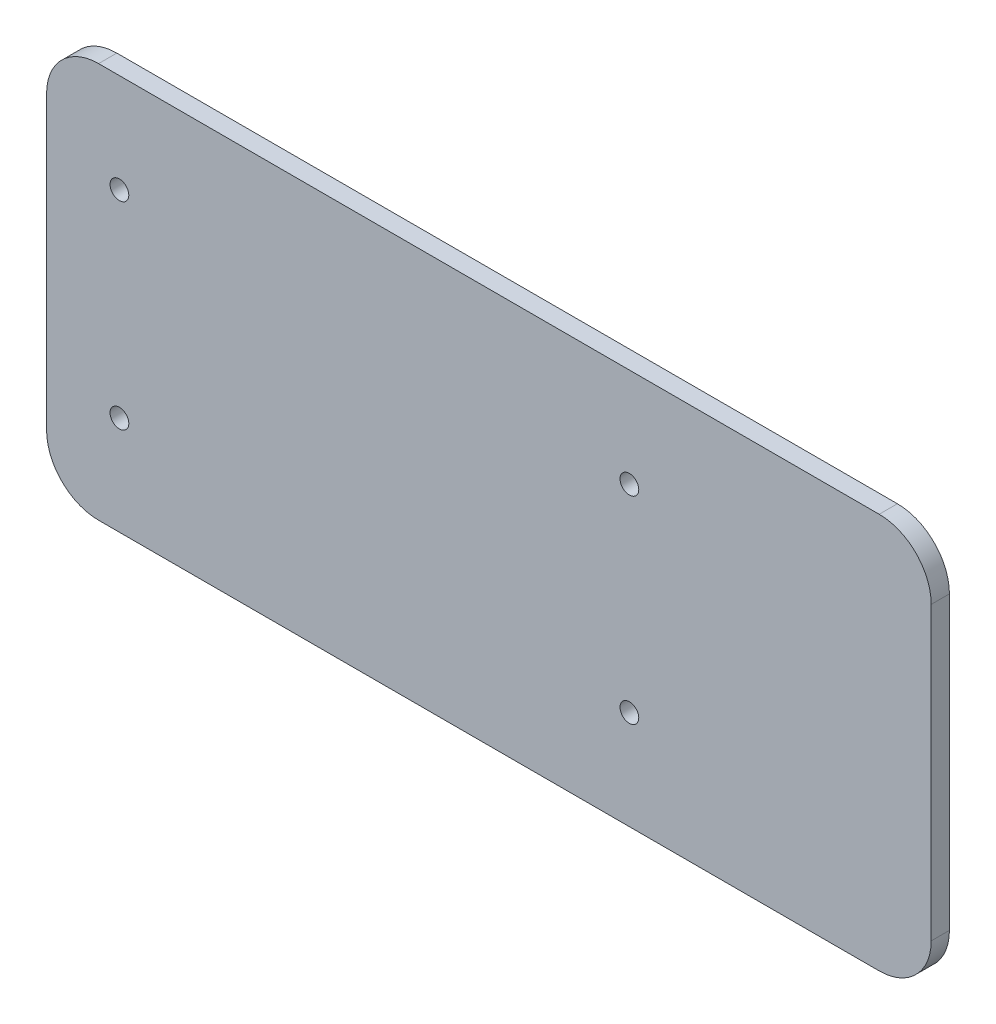
ISO-10303-21;
HEADER;
FILE_DESCRIPTION(('STEP AP214'),'2;1');
FILE_NAME('part.step','',(''),(''),'','','');
FILE_SCHEMA(('AUTOMOTIVE_DESIGN { 1 0 10303 214 1 1 1 1 }'));
ENDSEC;
DATA;
#1=APPLICATION_CONTEXT('core data for automotive mechanical design processes');
#2=APPLICATION_PROTOCOL_DEFINITION('international standard','automotive_design',2000,#1);
#3=PRODUCT_CONTEXT('',#1,'mechanical');
#4=PRODUCT('Part','Part','',(#3));
#5=PRODUCT_RELATED_PRODUCT_CATEGORY('part','',(#4));
#6=PRODUCT_DEFINITION_FORMATION('','',#4);
#7=PRODUCT_DEFINITION_CONTEXT('part definition',#1,'design');
#8=PRODUCT_DEFINITION('design','',#6,#7);
#9=PRODUCT_DEFINITION_SHAPE('','',#8);
#10=(LENGTH_UNIT() NAMED_UNIT(*) SI_UNIT(.MILLI.,.METRE.));
#11=(NAMED_UNIT(*) PLANE_ANGLE_UNIT() SI_UNIT($,.RADIAN.));
#12=(NAMED_UNIT(*) SI_UNIT($,.STERADIAN.) SOLID_ANGLE_UNIT());
#13=UNCERTAINTY_MEASURE_WITH_UNIT(LENGTH_MEASURE(1.E-05),#10,'distance_accuracy_value','');
#14=(GEOMETRIC_REPRESENTATION_CONTEXT(3) GLOBAL_UNCERTAINTY_ASSIGNED_CONTEXT((#13)) GLOBAL_UNIT_ASSIGNED_CONTEXT((#10,
#11,#12)) REPRESENTATION_CONTEXT('',''));
#15=CARTESIAN_POINT('',(0.,0.,0.));
#16=DIRECTION('',(0.,0.,1.));
#17=DIRECTION('',(1.,0.,0.));
#18=AXIS2_PLACEMENT_3D('',#15,#16,#17);
#19=CARTESIAN_POINT('',(85.,38.,3.5));
#20=DIRECTION('',(-1.,0.,0.));
#21=DIRECTION('',(0.,-1.,0.));
#22=AXIS2_PLACEMENT_3D('',#19,#20,#21);
#23=PLANE('',#22);
#24=DIRECTION('',(0.,1.,0.));
#25=VECTOR('',#24,1.);
#26=CARTESIAN_POINT('',(85.,38.,3.5));
#27=LINE('',#26,#25);
#28=CARTESIAN_POINT('',(85.,-28.,3.5));
#29=VERTEX_POINT('',#28);
#30=CARTESIAN_POINT('',(85.,28.,3.5));
#31=VERTEX_POINT('',#30);
#32=EDGE_CURVE('E229',#29,#31,#27,.T.);
#33=ORIENTED_EDGE('',*,*,#32,.F.);
#34=DIRECTION('',(0.,0.,-1.));
#35=VECTOR('',#34,1.);
#36=CARTESIAN_POINT('',(85.,-28.,3.5));
#37=LINE('',#36,#35);
#38=CARTESIAN_POINT('',(85.,-28.,0.));
#39=VERTEX_POINT('',#38);
#40=EDGE_CURVE('E11',#29,#39,#37,.T.);
#41=ORIENTED_EDGE('',*,*,#40,.T.);
#42=DIRECTION('',(0.,1.,0.));
#43=VECTOR('',#42,1.);
#44=CARTESIAN_POINT('',(85.,38.,0.));
#45=LINE('',#44,#43);
#46=CARTESIAN_POINT('',(85.,28.,0.));
#47=VERTEX_POINT('',#46);
#48=EDGE_CURVE('E223',#39,#47,#45,.T.);
#49=ORIENTED_EDGE('',*,*,#48,.T.);
#50=DIRECTION('',(0.,0.,-1.));
#51=VECTOR('',#50,1.);
#52=CARTESIAN_POINT('',(85.,28.,3.5));
#53=LINE('',#52,#51);
#54=EDGE_CURVE('E52',#47,#31,#53,.F.);
#55=ORIENTED_EDGE('',*,*,#54,.T.);
#56=EDGE_LOOP('',(#33,#41,#49,#55));
#57=FACE_BOUND('',#56,.T.);
#58=ADVANCED_FACE('F44',(#57),#23,.F.);
#59=CARTESIAN_POINT('',(-85.,38.,3.5));
#60=DIRECTION('',(0.,-1.,0.));
#61=DIRECTION('',(0.,0.,-1.));
#62=AXIS2_PLACEMENT_3D('',#59,#60,#61);
#63=PLANE('',#62);
#64=DIRECTION('',(-1.,0.,0.));
#65=VECTOR('',#64,1.);
#66=CARTESIAN_POINT('',(-85.,38.,0.));
#67=LINE('',#66,#65);
#68=CARTESIAN_POINT('',(75.,38.,0.));
#69=VERTEX_POINT('',#68);
#70=CARTESIAN_POINT('',(-75.,38.,0.));
#71=VERTEX_POINT('',#70);
#72=EDGE_CURVE('E245',#69,#71,#67,.T.);
#73=ORIENTED_EDGE('',*,*,#72,.T.);
#74=DIRECTION('',(0.,0.,-1.));
#75=VECTOR('',#74,1.);
#76=CARTESIAN_POINT('',(-75.,38.,3.5));
#77=LINE('',#76,#75);
#78=CARTESIAN_POINT('',(-75.,38.,3.5));
#79=VERTEX_POINT('',#78);
#80=EDGE_CURVE('E268',#71,#79,#77,.F.);
#81=ORIENTED_EDGE('',*,*,#80,.T.);
#82=DIRECTION('',(-1.,0.,0.));
#83=VECTOR('',#82,1.);
#84=CARTESIAN_POINT('',(-85.,38.,3.5));
#85=LINE('',#84,#83);
#86=CARTESIAN_POINT('',(75.,38.,3.5));
#87=VERTEX_POINT('',#86);
#88=EDGE_CURVE('E232',#87,#79,#85,.T.);
#89=ORIENTED_EDGE('',*,*,#88,.F.);
#90=DIRECTION('',(0.,0.,-1.));
#91=VECTOR('',#90,1.);
#92=CARTESIAN_POINT('',(75.,38.,3.5));
#93=LINE('',#92,#91);
#94=EDGE_CURVE('E265',#87,#69,#93,.T.);
#95=ORIENTED_EDGE('',*,*,#94,.T.);
#96=EDGE_LOOP('',(#73,#81,#89,#95));
#97=FACE_BOUND('',#96,.T.);
#98=ADVANCED_FACE('F296',(#97),#63,.F.);
#99=CARTESIAN_POINT('',(-85.,38.,3.5));
#100=DIRECTION('',(1.,0.,0.));
#101=DIRECTION('',(0.,1.,0.));
#102=AXIS2_PLACEMENT_3D('',#99,#100,#101);
#103=PLANE('',#102);
#104=DIRECTION('',(0.,-1.,0.));
#105=VECTOR('',#104,1.);
#106=CARTESIAN_POINT('',(-85.,38.,3.5));
#107=LINE('',#106,#105);
#108=CARTESIAN_POINT('',(-85.,28.,3.5));
#109=VERTEX_POINT('',#108);
#110=CARTESIAN_POINT('',(-85.,-28.,3.5));
#111=VERTEX_POINT('',#110);
#112=EDGE_CURVE('E236',#109,#111,#107,.T.);
#113=ORIENTED_EDGE('',*,*,#112,.F.);
#114=DIRECTION('',(0.,0.,-1.));
#115=VECTOR('',#114,1.);
#116=CARTESIAN_POINT('',(-85.,28.,3.5));
#117=LINE('',#116,#115);
#118=CARTESIAN_POINT('',(-85.,28.,0.));
#119=VERTEX_POINT('',#118);
#120=EDGE_CURVE('E254',#109,#119,#117,.T.);
#121=ORIENTED_EDGE('',*,*,#120,.T.);
#122=DIRECTION('',(0.,-1.,0.));
#123=VECTOR('',#122,1.);
#124=CARTESIAN_POINT('',(-85.,38.,0.));
#125=LINE('',#124,#123);
#126=CARTESIAN_POINT('',(-85.,-28.,0.));
#127=VERTEX_POINT('',#126);
#128=EDGE_CURVE('E248',#119,#127,#125,.T.);
#129=ORIENTED_EDGE('',*,*,#128,.T.);
#130=DIRECTION('',(0.,0.,-1.));
#131=VECTOR('',#130,1.);
#132=CARTESIAN_POINT('',(-85.,-28.,3.5));
#133=LINE('',#132,#131);
#134=EDGE_CURVE('E242',#127,#111,#133,.F.);
#135=ORIENTED_EDGE('',*,*,#134,.T.);
#136=EDGE_LOOP('',(#113,#121,#129,#135));
#137=FACE_BOUND('',#136,.T.);
#138=ADVANCED_FACE('F307',(#137),#103,.F.);
#139=CARTESIAN_POINT('',(-85.,-38.,3.5));
#140=DIRECTION('',(0.,1.,0.));
#141=DIRECTION('',(0.,0.,1.));
#142=AXIS2_PLACEMENT_3D('',#139,#140,#141);
#143=PLANE('',#142);
#144=DIRECTION('',(1.,0.,0.));
#145=VECTOR('',#144,1.);
#146=CARTESIAN_POINT('',(-85.,-38.,3.5));
#147=LINE('',#146,#145);
#148=CARTESIAN_POINT('',(-75.,-38.,3.5));
#149=VERTEX_POINT('',#148);
#150=CARTESIAN_POINT('',(75.,-38.,3.5));
#151=VERTEX_POINT('',#150);
#152=EDGE_CURVE('E239',#149,#151,#147,.T.);
#153=ORIENTED_EDGE('',*,*,#152,.F.);
#154=DIRECTION('',(0.,0.,-1.));
#155=VECTOR('',#154,1.);
#156=CARTESIAN_POINT('',(-75.,-38.,3.5));
#157=LINE('',#156,#155);
#158=CARTESIAN_POINT('',(-75.,-38.,0.));
#159=VERTEX_POINT('',#158);
#160=EDGE_CURVE('E280',#149,#159,#157,.T.);
#161=ORIENTED_EDGE('',*,*,#160,.T.);
#162=DIRECTION('',(1.,0.,0.));
#163=VECTOR('',#162,1.);
#164=CARTESIAN_POINT('',(-85.,-38.,0.));
#165=LINE('',#164,#163);
#166=CARTESIAN_POINT('',(75.,-38.,0.));
#167=VERTEX_POINT('',#166);
#168=EDGE_CURVE('E233',#159,#167,#165,.T.);
#169=ORIENTED_EDGE('',*,*,#168,.T.);
#170=DIRECTION('',(0.,0.,-1.));
#171=VECTOR('',#170,1.);
#172=CARTESIAN_POINT('',(75.,-38.,3.5));
#173=LINE('',#172,#171);
#174=EDGE_CURVE('E278',#167,#151,#173,.F.);
#175=ORIENTED_EDGE('',*,*,#174,.T.);
#176=EDGE_LOOP('',(#153,#161,#169,#175));
#177=FACE_BOUND('',#176,.T.);
#178=ADVANCED_FACE('F316',(#177),#143,.F.);
#179=CARTESIAN_POINT('',(0.,0.,3.5));
#180=DIRECTION('',(0.,0.,1.));
#181=DIRECTION('',(1.,0.,0.));
#182=AXIS2_PLACEMENT_3D('',#179,#180,#181);
#183=PLANE('',#182);
#184=CARTESIAN_POINT('',(27.,19.,3.5));
#185=DIRECTION('',(0.,0.,1.));
#186=DIRECTION('',(1.,0.,0.));
#187=AXIS2_PLACEMENT_3D('',#184,#185,#186);
#188=CIRCLE('',#187,1.79999999999999);
#189=CARTESIAN_POINT('',(28.8,19.,3.5));
#190=VERTEX_POINT('',#189);
#191=EDGE_CURVE('E614',#190,#190,#188,.T.);
#192=ORIENTED_EDGE('',*,*,#191,.F.);
#193=EDGE_LOOP('',(#192));
#194=FACE_BOUND('',#193,.T.);
#195=CARTESIAN_POINT('',(27.,-19.,3.5));
#196=DIRECTION('',(0.,0.,1.));
#197=DIRECTION('',(1.,0.,0.));
#198=AXIS2_PLACEMENT_3D('',#195,#196,#197);
#199=CIRCLE('',#198,1.79999999999999);
#200=CARTESIAN_POINT('',(28.8,-19.,3.5));
#201=VERTEX_POINT('',#200);
#202=EDGE_CURVE('E608',#201,#201,#199,.F.);
#203=ORIENTED_EDGE('',*,*,#202,.T.);
#204=EDGE_LOOP('',(#203));
#205=FACE_BOUND('',#204,.T.);
#206=CARTESIAN_POINT('',(-71.,19.,3.5));
#207=DIRECTION('',(0.,0.,1.));
#208=DIRECTION('',(1.,0.,0.));
#209=AXIS2_PLACEMENT_3D('',#206,#207,#208);
#210=CIRCLE('',#209,1.79999999999999);
#211=CARTESIAN_POINT('',(-69.2,19.,3.5));
#212=VERTEX_POINT('',#211);
#213=EDGE_CURVE('E601',#212,#212,#210,.F.);
#214=ORIENTED_EDGE('',*,*,#213,.T.);
#215=EDGE_LOOP('',(#214));
#216=FACE_BOUND('',#215,.T.);
#217=CARTESIAN_POINT('',(-71.,-19.,3.5));
#218=DIRECTION('',(0.,0.,1.));
#219=DIRECTION('',(1.,0.,0.));
#220=AXIS2_PLACEMENT_3D('',#217,#218,#219);
#221=CIRCLE('',#220,1.79999999999999);
#222=CARTESIAN_POINT('',(-69.2,-19.,3.5));
#223=VERTEX_POINT('',#222);
#224=EDGE_CURVE('E183',#223,#223,#221,.T.);
#225=ORIENTED_EDGE('',*,*,#224,.F.);
#226=EDGE_LOOP('',(#225));
#227=FACE_BOUND('',#226,.T.);
#228=ORIENTED_EDGE('',*,*,#88,.T.);
#229=CARTESIAN_POINT('',(-75.,28.,3.5));
#230=DIRECTION('',(0.,0.,1.));
#231=DIRECTION('',(1.,0.,0.));
#232=AXIS2_PLACEMENT_3D('',#229,#230,#231);
#233=CIRCLE('',#232,10.);
#234=EDGE_CURVE('E276',#79,#109,#233,.T.);
#235=ORIENTED_EDGE('',*,*,#234,.T.);
#236=ORIENTED_EDGE('',*,*,#112,.T.);
#237=CARTESIAN_POINT('',(-75.,-28.,3.5));
#238=DIRECTION('',(0.,0.,1.));
#239=DIRECTION('',(1.,0.,0.));
#240=AXIS2_PLACEMENT_3D('',#237,#238,#239);
#241=CIRCLE('',#240,10.);
#242=EDGE_CURVE('E274',#111,#149,#241,.T.);
#243=ORIENTED_EDGE('',*,*,#242,.T.);
#244=ORIENTED_EDGE('',*,*,#152,.T.);
#245=CARTESIAN_POINT('',(75.,-28.,3.5));
#246=DIRECTION('',(0.,0.,1.));
#247=DIRECTION('',(1.,0.,0.));
#248=AXIS2_PLACEMENT_3D('',#245,#246,#247);
#249=CIRCLE('',#248,10.);
#250=EDGE_CURVE('E272',#151,#29,#249,.T.);
#251=ORIENTED_EDGE('',*,*,#250,.T.);
#252=ORIENTED_EDGE('',*,*,#32,.T.);
#253=CARTESIAN_POINT('',(75.,28.,3.5));
#254=DIRECTION('',(0.,0.,1.));
#255=DIRECTION('',(1.,0.,0.));
#256=AXIS2_PLACEMENT_3D('',#253,#254,#255);
#257=CIRCLE('',#256,10.);
#258=EDGE_CURVE('E270',#31,#87,#257,.T.);
#259=ORIENTED_EDGE('',*,*,#258,.T.);
#260=EDGE_LOOP('',(#228,#235,#236,#243,#244,#251,#252,#259));
#261=FACE_BOUND('',#260,.T.);
#262=ADVANCED_FACE('F290',(#194,#205,#216,#227,#261),#183,.T.);
#263=CARTESIAN_POINT('',(0.,0.,0.));
#264=DIRECTION('',(0.,0.,1.));
#265=DIRECTION('',(1.,0.,0.));
#266=AXIS2_PLACEMENT_3D('',#263,#264,#265);
#267=PLANE('',#266);
#268=CARTESIAN_POINT('',(27.,19.,0.));
#269=DIRECTION('',(0.,0.,-1.));
#270=DIRECTION('',(1.,0.,0.));
#271=AXIS2_PLACEMENT_3D('',#268,#269,#270);
#272=CIRCLE('',#271,1.79999999999999);
#273=CARTESIAN_POINT('',(28.8,19.,0.));
#274=VERTEX_POINT('',#273);
#275=EDGE_CURVE('E617',#274,#274,#272,.T.);
#276=ORIENTED_EDGE('',*,*,#275,.F.);
#277=EDGE_LOOP('',(#276));
#278=FACE_BOUND('',#277,.T.);
#279=CARTESIAN_POINT('',(27.,-19.,0.));
#280=DIRECTION('',(0.,0.,1.));
#281=DIRECTION('',(1.,0.,0.));
#282=AXIS2_PLACEMENT_3D('',#279,#280,#281);
#283=CIRCLE('',#282,1.79999999999999);
#284=CARTESIAN_POINT('',(28.8,-19.,0.));
#285=VERTEX_POINT('',#284);
#286=EDGE_CURVE('E611',#285,#285,#283,.T.);
#287=ORIENTED_EDGE('',*,*,#286,.T.);
#288=EDGE_LOOP('',(#287));
#289=FACE_BOUND('',#288,.T.);
#290=CARTESIAN_POINT('',(-71.,19.,0.));
#291=DIRECTION('',(0.,0.,1.));
#292=DIRECTION('',(-1.,0.,0.));
#293=AXIS2_PLACEMENT_3D('',#290,#291,#292);
#294=CIRCLE('',#293,1.79999999999999);
#295=CARTESIAN_POINT('',(-72.8,19.,0.));
#296=VERTEX_POINT('',#295);
#297=EDGE_CURVE('E603',#296,#296,#294,.T.);
#298=ORIENTED_EDGE('',*,*,#297,.T.);
#299=EDGE_LOOP('',(#298));
#300=FACE_BOUND('',#299,.T.);
#301=CARTESIAN_POINT('',(-71.,-19.,0.));
#302=DIRECTION('',(0.,0.,-1.));
#303=DIRECTION('',(-1.,0.,0.));
#304=AXIS2_PLACEMENT_3D('',#301,#302,#303);
#305=CIRCLE('',#304,1.79999999999999);
#306=CARTESIAN_POINT('',(-72.8,-19.,0.));
#307=VERTEX_POINT('',#306);
#308=EDGE_CURVE('E599',#307,#307,#305,.T.);
#309=ORIENTED_EDGE('',*,*,#308,.F.);
#310=EDGE_LOOP('',(#309));
#311=FACE_BOUND('',#310,.T.);
#312=DIRECTION('',(-1.,0.,0.));
#313=VECTOR('',#312,1.);
#314=CARTESIAN_POINT('',(-75.,-9.99999999999999,0.));
#315=LINE('',#314,#313);
#316=CARTESIAN_POINT('',(-67.,-9.99999999999999,0.));
#317=VERTEX_POINT('',#316);
#318=CARTESIAN_POINT('',(-75.,-9.99999999999999,0.));
#319=VERTEX_POINT('',#318);
#320=EDGE_CURVE('E189',#317,#319,#315,.T.);
#321=ORIENTED_EDGE('',*,*,#320,.F.);
#322=DIRECTION('',(0.,-1.,0.));
#323=VECTOR('',#322,1.);
#324=CARTESIAN_POINT('',(-67.,10.,0.));
#325=LINE('',#324,#323);
#326=CARTESIAN_POINT('',(-67.,10.,0.));
#327=VERTEX_POINT('',#326);
#328=EDGE_CURVE('E59',#327,#317,#325,.T.);
#329=ORIENTED_EDGE('',*,*,#328,.F.);
#330=DIRECTION('',(1.,0.,0.));
#331=VECTOR('',#330,1.);
#332=CARTESIAN_POINT('',(-75.,10.,0.));
#333=LINE('',#332,#331);
#334=CARTESIAN_POINT('',(-75.,10.,0.));
#335=VERTEX_POINT('',#334);
#336=EDGE_CURVE('E177',#335,#327,#333,.T.);
#337=ORIENTED_EDGE('',*,*,#336,.F.);
#338=DIRECTION('',(0.,1.,0.));
#339=VECTOR('',#338,1.);
#340=CARTESIAN_POINT('',(-75.,10.,0.));
#341=LINE('',#340,#339);
#342=EDGE_CURVE('E180',#319,#335,#341,.T.);
#343=ORIENTED_EDGE('',*,*,#342,.F.);
#344=EDGE_LOOP('',(#321,#329,#337,#343));
#345=FACE_BOUND('',#344,.T.);
#346=DIRECTION('',(-1.,0.,0.));
#347=VECTOR('',#346,1.);
#348=CARTESIAN_POINT('',(23.,-9.99999999999999,0.));
#349=LINE('',#348,#347);
#350=CARTESIAN_POINT('',(31.,-9.99999999999999,0.));
#351=VERTEX_POINT('',#350);
#352=CARTESIAN_POINT('',(23.,-9.99999999999999,0.));
#353=VERTEX_POINT('',#352);
#354=EDGE_CURVE('E213',#351,#353,#349,.T.);
#355=ORIENTED_EDGE('',*,*,#354,.F.);
#356=DIRECTION('',(0.,-1.,0.));
#357=VECTOR('',#356,1.);
#358=CARTESIAN_POINT('',(31.,10.,0.));
#359=LINE('',#358,#357);
#360=CARTESIAN_POINT('',(31.,10.,0.));
#361=VERTEX_POINT('',#360);
#362=EDGE_CURVE('E67',#361,#351,#359,.T.);
#363=ORIENTED_EDGE('',*,*,#362,.F.);
#364=DIRECTION('',(1.,0.,0.));
#365=VECTOR('',#364,1.);
#366=CARTESIAN_POINT('',(23.,10.,0.));
#367=LINE('',#366,#365);
#368=CARTESIAN_POINT('',(23.,10.,0.));
#369=VERTEX_POINT('',#368);
#370=EDGE_CURVE('E202',#369,#361,#367,.T.);
#371=ORIENTED_EDGE('',*,*,#370,.F.);
#372=DIRECTION('',(0.,1.,0.));
#373=VECTOR('',#372,1.);
#374=CARTESIAN_POINT('',(23.,10.,0.));
#375=LINE('',#374,#373);
#376=EDGE_CURVE('E216',#353,#369,#375,.T.);
#377=ORIENTED_EDGE('',*,*,#376,.F.);
#378=EDGE_LOOP('',(#355,#363,#371,#377));
#379=FACE_BOUND('',#378,.T.);
#380=ORIENTED_EDGE('',*,*,#128,.F.);
#381=CARTESIAN_POINT('',(-75.,28.,0.));
#382=DIRECTION('',(0.,0.,1.));
#383=DIRECTION('',(1.,0.,0.));
#384=AXIS2_PLACEMENT_3D('',#381,#382,#383);
#385=CIRCLE('',#384,10.);
#386=EDGE_CURVE('E263',#119,#71,#385,.F.);
#387=ORIENTED_EDGE('',*,*,#386,.T.);
#388=ORIENTED_EDGE('',*,*,#72,.F.);
#389=CARTESIAN_POINT('',(75.,28.,0.));
#390=DIRECTION('',(0.,0.,1.));
#391=DIRECTION('',(1.,0.,0.));
#392=AXIS2_PLACEMENT_3D('',#389,#390,#391);
#393=CIRCLE('',#392,10.);
#394=EDGE_CURVE('E257',#69,#47,#393,.F.);
#395=ORIENTED_EDGE('',*,*,#394,.T.);
#396=ORIENTED_EDGE('',*,*,#48,.F.);
#397=CARTESIAN_POINT('',(75.,-28.,0.));
#398=DIRECTION('',(0.,0.,1.));
#399=DIRECTION('',(1.,0.,0.));
#400=AXIS2_PLACEMENT_3D('',#397,#398,#399);
#401=CIRCLE('',#400,10.);
#402=EDGE_CURVE('E259',#39,#167,#401,.F.);
#403=ORIENTED_EDGE('',*,*,#402,.T.);
#404=ORIENTED_EDGE('',*,*,#168,.F.);
#405=CARTESIAN_POINT('',(-75.,-28.,0.));
#406=DIRECTION('',(0.,0.,1.));
#407=DIRECTION('',(1.,0.,0.));
#408=AXIS2_PLACEMENT_3D('',#405,#406,#407);
#409=CIRCLE('',#408,10.);
#410=EDGE_CURVE('E261',#159,#127,#409,.F.);
#411=ORIENTED_EDGE('',*,*,#410,.T.);
#412=EDGE_LOOP('',(#380,#387,#388,#395,#396,#403,#404,#411));
#413=FACE_BOUND('',#412,.T.);
#414=ADVANCED_FACE('F300',(#278,#289,#300,#311,#345,#379,#413),#267,.F.);
#415=CARTESIAN_POINT('',(-75.,28.,3.5));
#416=DIRECTION('',(0.,0.,-1.));
#417=DIRECTION('',(-1.,0.,0.));
#418=AXIS2_PLACEMENT_3D('',#415,#416,#417);
#419=CYLINDRICAL_SURFACE('',#418,10.);
#420=ORIENTED_EDGE('',*,*,#234,.F.);
#421=ORIENTED_EDGE('',*,*,#80,.F.);
#422=ORIENTED_EDGE('',*,*,#386,.F.);
#423=ORIENTED_EDGE('',*,*,#120,.F.);
#424=EDGE_LOOP('',(#420,#421,#422,#423));
#425=FACE_BOUND('',#424,.T.);
#426=ADVANCED_FACE('F304',(#425),#419,.T.);
#427=CARTESIAN_POINT('',(-75.,-28.,3.5));
#428=DIRECTION('',(0.,0.,-1.));
#429=DIRECTION('',(-1.,0.,0.));
#430=AXIS2_PLACEMENT_3D('',#427,#428,#429);
#431=CYLINDRICAL_SURFACE('',#430,10.);
#432=ORIENTED_EDGE('',*,*,#242,.F.);
#433=ORIENTED_EDGE('',*,*,#134,.F.);
#434=ORIENTED_EDGE('',*,*,#410,.F.);
#435=ORIENTED_EDGE('',*,*,#160,.F.);
#436=EDGE_LOOP('',(#432,#433,#434,#435));
#437=FACE_BOUND('',#436,.T.);
#438=ADVANCED_FACE('F313',(#437),#431,.T.);
#439=CARTESIAN_POINT('',(75.,-28.,3.5));
#440=DIRECTION('',(0.,0.,-1.));
#441=DIRECTION('',(-1.,0.,0.));
#442=AXIS2_PLACEMENT_3D('',#439,#440,#441);
#443=CYLINDRICAL_SURFACE('',#442,10.);
#444=ORIENTED_EDGE('',*,*,#250,.F.);
#445=ORIENTED_EDGE('',*,*,#174,.F.);
#446=ORIENTED_EDGE('',*,*,#402,.F.);
#447=ORIENTED_EDGE('',*,*,#40,.F.);
#448=EDGE_LOOP('',(#444,#445,#446,#447));
#449=FACE_BOUND('',#448,.T.);
#450=ADVANCED_FACE('F319',(#449),#443,.T.);
#451=CARTESIAN_POINT('',(75.,28.,3.5));
#452=DIRECTION('',(0.,0.,-1.));
#453=DIRECTION('',(-1.,0.,0.));
#454=AXIS2_PLACEMENT_3D('',#451,#452,#453);
#455=CYLINDRICAL_SURFACE('',#454,10.);
#456=ORIENTED_EDGE('',*,*,#258,.F.);
#457=ORIENTED_EDGE('',*,*,#54,.F.);
#458=ORIENTED_EDGE('',*,*,#394,.F.);
#459=ORIENTED_EDGE('',*,*,#94,.F.);
#460=EDGE_LOOP('',(#456,#457,#458,#459));
#461=FACE_BOUND('',#460,.T.);
#462=ADVANCED_FACE('F46',(#461),#455,.T.);
#463=CARTESIAN_POINT('',(31.,10.,3.));
#464=DIRECTION('',(1.,0.,0.));
#465=DIRECTION('',(0.,0.,-1.));
#466=AXIS2_PLACEMENT_3D('',#463,#464,#465);
#467=PLANE('',#466);
#468=ORIENTED_EDGE('',*,*,#362,.T.);
#469=DIRECTION('',(0.,0.,-1.));
#470=VECTOR('',#469,1.);
#471=CARTESIAN_POINT('',(31.,-9.99999999999999,3.));
#472=LINE('',#471,#470);
#473=CARTESIAN_POINT('',(31.,-9.99999999999999,3.));
#474=VERTEX_POINT('',#473);
#475=EDGE_CURVE('E211',#474,#351,#472,.T.);
#476=ORIENTED_EDGE('',*,*,#475,.F.);
#477=DIRECTION('',(0.,-1.,0.));
#478=VECTOR('',#477,1.);
#479=CARTESIAN_POINT('',(31.,10.,3.));
#480=LINE('',#479,#478);
#481=CARTESIAN_POINT('',(31.,10.,3.));
#482=VERTEX_POINT('',#481);
#483=EDGE_CURVE('E198',#482,#474,#480,.T.);
#484=ORIENTED_EDGE('',*,*,#483,.F.);
#485=DIRECTION('',(0.,0.,-1.));
#486=VECTOR('',#485,1.);
#487=CARTESIAN_POINT('',(31.,10.,3.));
#488=LINE('',#487,#486);
#489=EDGE_CURVE('E221',#482,#361,#488,.T.);
#490=ORIENTED_EDGE('',*,*,#489,.T.);
#491=EDGE_LOOP('',(#468,#476,#484,#490));
#492=FACE_BOUND('',#491,.T.);
#493=ADVANCED_FACE('F325',(#492),#467,.F.);
#494=CARTESIAN_POINT('',(23.,10.,3.));
#495=DIRECTION('',(0.,1.,0.));
#496=DIRECTION('',(0.,0.,1.));
#497=AXIS2_PLACEMENT_3D('',#494,#495,#496);
#498=PLANE('',#497);
#499=ORIENTED_EDGE('',*,*,#370,.T.);
#500=ORIENTED_EDGE('',*,*,#489,.F.);
#501=DIRECTION('',(1.,0.,0.));
#502=VECTOR('',#501,1.);
#503=CARTESIAN_POINT('',(23.,10.,3.));
#504=LINE('',#503,#502);
#505=CARTESIAN_POINT('',(23.,10.,3.));
#506=VERTEX_POINT('',#505);
#507=EDGE_CURVE('E208',#506,#482,#504,.T.);
#508=ORIENTED_EDGE('',*,*,#507,.F.);
#509=DIRECTION('',(0.,0.,-1.));
#510=VECTOR('',#509,1.);
#511=CARTESIAN_POINT('',(23.,10.,3.));
#512=LINE('',#511,#510);
#513=EDGE_CURVE('E224',#506,#369,#512,.T.);
#514=ORIENTED_EDGE('',*,*,#513,.T.);
#515=EDGE_LOOP('',(#499,#500,#508,#514));
#516=FACE_BOUND('',#515,.T.);
#517=ADVANCED_FACE('F490',(#516),#498,.F.);
#518=CARTESIAN_POINT('',(23.,10.,3.));
#519=DIRECTION('',(-1.,0.,0.));
#520=DIRECTION('',(0.,0.,1.));
#521=AXIS2_PLACEMENT_3D('',#518,#519,#520);
#522=PLANE('',#521);
#523=ORIENTED_EDGE('',*,*,#376,.T.);
#524=ORIENTED_EDGE('',*,*,#513,.F.);
#525=DIRECTION('',(0.,1.,0.));
#526=VECTOR('',#525,1.);
#527=CARTESIAN_POINT('',(23.,10.,3.));
#528=LINE('',#527,#526);
#529=CARTESIAN_POINT('',(23.,-9.99999999999999,3.));
#530=VERTEX_POINT('',#529);
#531=EDGE_CURVE('E205',#530,#506,#528,.T.);
#532=ORIENTED_EDGE('',*,*,#531,.F.);
#533=DIRECTION('',(0.,0.,-1.));
#534=VECTOR('',#533,1.);
#535=CARTESIAN_POINT('',(23.,-9.99999999999999,3.));
#536=LINE('',#535,#534);
#537=EDGE_CURVE('E226',#530,#353,#536,.T.);
#538=ORIENTED_EDGE('',*,*,#537,.T.);
#539=EDGE_LOOP('',(#523,#524,#532,#538));
#540=FACE_BOUND('',#539,.T.);
#541=ADVANCED_FACE('F480',(#540),#522,.F.);
#542=CARTESIAN_POINT('',(23.,-9.99999999999999,3.));
#543=DIRECTION('',(0.,-1.,0.));
#544=DIRECTION('',(1.,0.,0.));
#545=AXIS2_PLACEMENT_3D('',#542,#543,#544);
#546=PLANE('',#545);
#547=ORIENTED_EDGE('',*,*,#354,.T.);
#548=ORIENTED_EDGE('',*,*,#537,.F.);
#549=DIRECTION('',(-1.,0.,0.));
#550=VECTOR('',#549,1.);
#551=CARTESIAN_POINT('',(23.,-9.99999999999999,3.));
#552=LINE('',#551,#550);
#553=EDGE_CURVE('E201',#474,#530,#552,.T.);
#554=ORIENTED_EDGE('',*,*,#553,.F.);
#555=ORIENTED_EDGE('',*,*,#475,.T.);
#556=EDGE_LOOP('',(#547,#548,#554,#555));
#557=FACE_BOUND('',#556,.T.);
#558=ADVANCED_FACE('F470',(#557),#546,.F.);
#559=CARTESIAN_POINT('',(0.,0.,3.));
#560=DIRECTION('',(0.,0.,1.));
#561=DIRECTION('',(1.,0.,0.));
#562=AXIS2_PLACEMENT_3D('',#559,#560,#561);
#563=PLANE('',#562);
#564=ORIENTED_EDGE('',*,*,#483,.T.);
#565=ORIENTED_EDGE('',*,*,#553,.T.);
#566=ORIENTED_EDGE('',*,*,#531,.T.);
#567=ORIENTED_EDGE('',*,*,#507,.T.);
#568=EDGE_LOOP('',(#564,#565,#566,#567));
#569=FACE_BOUND('',#568,.T.);
#570=ADVANCED_FACE('F461',(#569),#563,.F.);
#571=CARTESIAN_POINT('',(-67.,10.,3.));
#572=DIRECTION('',(1.,0.,0.));
#573=DIRECTION('',(0.,0.,-1.));
#574=AXIS2_PLACEMENT_3D('',#571,#572,#573);
#575=PLANE('',#574);
#576=ORIENTED_EDGE('',*,*,#328,.T.);
#577=DIRECTION('',(0.,0.,-1.));
#578=VECTOR('',#577,1.);
#579=CARTESIAN_POINT('',(-67.,-9.99999999999999,3.));
#580=LINE('',#579,#578);
#581=CARTESIAN_POINT('',(-67.,-9.99999999999999,3.));
#582=VERTEX_POINT('',#581);
#583=EDGE_CURVE('E155',#582,#317,#580,.T.);
#584=ORIENTED_EDGE('',*,*,#583,.F.);
#585=DIRECTION('',(0.,-1.,0.));
#586=VECTOR('',#585,1.);
#587=CARTESIAN_POINT('',(-67.,10.,3.));
#588=LINE('',#587,#586);
#589=CARTESIAN_POINT('',(-67.,10.,3.));
#590=VERTEX_POINT('',#589);
#591=EDGE_CURVE('E159',#590,#582,#588,.T.);
#592=ORIENTED_EDGE('',*,*,#591,.F.);
#593=DIRECTION('',(0.,0.,-1.));
#594=VECTOR('',#593,1.);
#595=CARTESIAN_POINT('',(-67.,10.,3.));
#596=LINE('',#595,#594);
#597=EDGE_CURVE('E193',#590,#327,#596,.T.);
#598=ORIENTED_EDGE('',*,*,#597,.T.);
#599=EDGE_LOOP('',(#576,#584,#592,#598));
#600=FACE_BOUND('',#599,.T.);
#601=ADVANCED_FACE('F157',(#600),#575,.F.);
#602=CARTESIAN_POINT('',(-75.,10.,3.));
#603=DIRECTION('',(0.,1.,0.));
#604=DIRECTION('',(-1.,0.,0.));
#605=AXIS2_PLACEMENT_3D('',#602,#603,#604);
#606=PLANE('',#605);
#607=ORIENTED_EDGE('',*,*,#336,.T.);
#608=ORIENTED_EDGE('',*,*,#597,.F.);
#609=DIRECTION('',(1.,0.,0.));
#610=VECTOR('',#609,1.);
#611=CARTESIAN_POINT('',(-75.,10.,3.));
#612=LINE('',#611,#610);
#613=CARTESIAN_POINT('',(-75.,10.,3.));
#614=VERTEX_POINT('',#613);
#615=EDGE_CURVE('E165',#614,#590,#612,.T.);
#616=ORIENTED_EDGE('',*,*,#615,.F.);
#617=DIRECTION('',(0.,0.,-1.));
#618=VECTOR('',#617,1.);
#619=CARTESIAN_POINT('',(-75.,10.,3.));
#620=LINE('',#619,#618);
#621=EDGE_CURVE('E195',#614,#335,#620,.T.);
#622=ORIENTED_EDGE('',*,*,#621,.T.);
#623=EDGE_LOOP('',(#607,#608,#616,#622));
#624=FACE_BOUND('',#623,.T.);
#625=ADVANCED_FACE('F442',(#624),#606,.F.);
#626=CARTESIAN_POINT('',(-75.,10.,3.));
#627=DIRECTION('',(-1.,0.,0.));
#628=DIRECTION('',(0.,0.,1.));
#629=AXIS2_PLACEMENT_3D('',#626,#627,#628);
#630=PLANE('',#629);
#631=ORIENTED_EDGE('',*,*,#342,.T.);
#632=ORIENTED_EDGE('',*,*,#621,.F.);
#633=DIRECTION('',(0.,1.,0.));
#634=VECTOR('',#633,1.);
#635=CARTESIAN_POINT('',(-75.,10.,3.));
#636=LINE('',#635,#634);
#637=CARTESIAN_POINT('',(-75.,-9.99999999999999,3.));
#638=VERTEX_POINT('',#637);
#639=EDGE_CURVE('E173',#638,#614,#636,.T.);
#640=ORIENTED_EDGE('',*,*,#639,.F.);
#641=DIRECTION('',(0.,0.,-1.));
#642=VECTOR('',#641,1.);
#643=CARTESIAN_POINT('',(-75.,-9.99999999999999,3.));
#644=LINE('',#643,#642);
#645=EDGE_CURVE('E164',#638,#319,#644,.T.);
#646=ORIENTED_EDGE('',*,*,#645,.T.);
#647=EDGE_LOOP('',(#631,#632,#640,#646));
#648=FACE_BOUND('',#647,.T.);
#649=ADVANCED_FACE('F433',(#648),#630,.F.);
#650=CARTESIAN_POINT('',(-75.,-9.99999999999999,3.));
#651=DIRECTION('',(0.,-1.,0.));
#652=DIRECTION('',(1.,0.,0.));
#653=AXIS2_PLACEMENT_3D('',#650,#651,#652);
#654=PLANE('',#653);
#655=ORIENTED_EDGE('',*,*,#320,.T.);
#656=ORIENTED_EDGE('',*,*,#645,.F.);
#657=DIRECTION('',(-1.,0.,0.));
#658=VECTOR('',#657,1.);
#659=CARTESIAN_POINT('',(-75.,-9.99999999999999,3.));
#660=LINE('',#659,#658);
#661=EDGE_CURVE('E168',#582,#638,#660,.T.);
#662=ORIENTED_EDGE('',*,*,#661,.F.);
#663=ORIENTED_EDGE('',*,*,#583,.T.);
#664=EDGE_LOOP('',(#655,#656,#662,#663));
#665=FACE_BOUND('',#664,.T.);
#666=ADVANCED_FACE('F169',(#665),#654,.F.);
#667=CARTESIAN_POINT('',(0.,0.,3.));
#668=DIRECTION('',(0.,0.,1.));
#669=DIRECTION('',(1.,0.,0.));
#670=AXIS2_PLACEMENT_3D('',#667,#668,#669);
#671=PLANE('',#670);
#672=ORIENTED_EDGE('',*,*,#591,.T.);
#673=ORIENTED_EDGE('',*,*,#661,.T.);
#674=ORIENTED_EDGE('',*,*,#639,.T.);
#675=ORIENTED_EDGE('',*,*,#615,.T.);
#676=EDGE_LOOP('',(#672,#673,#674,#675));
#677=FACE_BOUND('',#676,.T.);
#678=ADVANCED_FACE('F175',(#677),#671,.F.);
#679=CARTESIAN_POINT('',(-71.,-19.,4.));
#680=DIRECTION('',(0.,0.,-1.));
#681=DIRECTION('',(-1.,0.,0.));
#682=AXIS2_PLACEMENT_3D('',#679,#680,#681);
#683=CYLINDRICAL_SURFACE('',#682,1.79999999999999);
#684=ORIENTED_EDGE('',*,*,#224,.T.);
#685=EDGE_LOOP('',(#684));
#686=FACE_BOUND('',#685,.T.);
#687=ORIENTED_EDGE('',*,*,#308,.T.);
#688=EDGE_LOOP('',(#687));
#689=FACE_BOUND('',#688,.T.);
#690=ADVANCED_FACE('F408',(#686,#689),#683,.F.);
#691=CARTESIAN_POINT('',(-71.,19.,4.));
#692=DIRECTION('',(0.,0.,-1.));
#693=DIRECTION('',(-1.,0.,0.));
#694=AXIS2_PLACEMENT_3D('',#691,#692,#693);
#695=CYLINDRICAL_SURFACE('',#694,1.79999999999999);
#696=ORIENTED_EDGE('',*,*,#213,.F.);
#697=EDGE_LOOP('',(#696));
#698=FACE_BOUND('',#697,.T.);
#699=ORIENTED_EDGE('',*,*,#297,.F.);
#700=EDGE_LOOP('',(#699));
#701=FACE_BOUND('',#700,.T.);
#702=ADVANCED_FACE('F371',(#698,#701),#695,.F.);
#703=CARTESIAN_POINT('',(27.,-19.,4.));
#704=DIRECTION('',(0.,0.,-1.));
#705=DIRECTION('',(-1.,0.,0.));
#706=AXIS2_PLACEMENT_3D('',#703,#704,#705);
#707=CYLINDRICAL_SURFACE('',#706,1.79999999999999);
#708=ORIENTED_EDGE('',*,*,#202,.F.);
#709=EDGE_LOOP('',(#708));
#710=FACE_BOUND('',#709,.T.);
#711=ORIENTED_EDGE('',*,*,#286,.F.);
#712=EDGE_LOOP('',(#711));
#713=FACE_BOUND('',#712,.T.);
#714=ADVANCED_FACE('F382',(#710,#713),#707,.F.);
#715=CARTESIAN_POINT('',(27.,19.,4.));
#716=DIRECTION('',(0.,0.,-1.));
#717=DIRECTION('',(-1.,0.,0.));
#718=AXIS2_PLACEMENT_3D('',#715,#716,#717);
#719=CYLINDRICAL_SURFACE('',#718,1.79999999999999);
#720=ORIENTED_EDGE('',*,*,#191,.T.);
#721=EDGE_LOOP('',(#720));
#722=FACE_BOUND('',#721,.T.);
#723=ORIENTED_EDGE('',*,*,#275,.T.);
#724=EDGE_LOOP('',(#723));
#725=FACE_BOUND('',#724,.T.);
#726=ADVANCED_FACE('F387',(#722,#725),#719,.F.);
#727=CLOSED_SHELL('',(#58,#98,#138,#178,#262,#414,#426,#438,#450,#462,#493,#517,#541,#558,#570,
#601,#625,#649,#666,#678,#690,#702,#714,#726));
#728=MANIFOLD_SOLID_BREP('B2',#727);
#729=ADVANCED_BREP_SHAPE_REPRESENTATION('',(#18,#728),#14);
#730=SHAPE_DEFINITION_REPRESENTATION(#9,#729);
ENDSEC;
END-ISO-10303-21;
